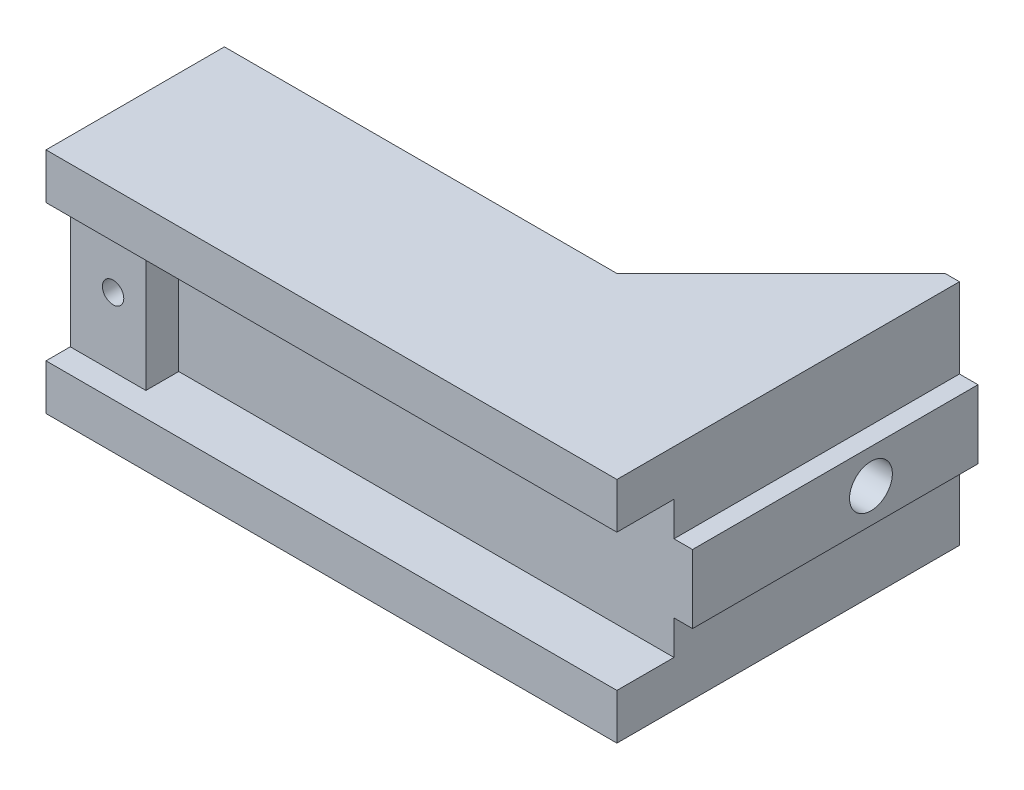
ISO-10303-21;
HEADER;
FILE_DESCRIPTION(('STEP AP214'),'2;1');
FILE_NAME('part.step','',(''),(''),'','','');
FILE_SCHEMA(('AUTOMOTIVE_DESIGN { 1 0 10303 214 1 1 1 1 }'));
ENDSEC;
DATA;
#1=APPLICATION_CONTEXT('core data for automotive mechanical design processes');
#2=APPLICATION_PROTOCOL_DEFINITION('international standard','automotive_design',2000,#1);
#3=PRODUCT_CONTEXT('',#1,'mechanical');
#4=PRODUCT('Part','Part','',(#3));
#5=PRODUCT_RELATED_PRODUCT_CATEGORY('part','',(#4));
#6=PRODUCT_DEFINITION_FORMATION('','',#4);
#7=PRODUCT_DEFINITION_CONTEXT('part definition',#1,'design');
#8=PRODUCT_DEFINITION('design','',#6,#7);
#9=PRODUCT_DEFINITION_SHAPE('','',#8);
#10=(LENGTH_UNIT() NAMED_UNIT(*) SI_UNIT(.MILLI.,.METRE.));
#11=(NAMED_UNIT(*) PLANE_ANGLE_UNIT() SI_UNIT($,.RADIAN.));
#12=(NAMED_UNIT(*) SI_UNIT($,.STERADIAN.) SOLID_ANGLE_UNIT());
#13=UNCERTAINTY_MEASURE_WITH_UNIT(LENGTH_MEASURE(1.E-05),#10,'distance_accuracy_value','');
#14=(GEOMETRIC_REPRESENTATION_CONTEXT(3) GLOBAL_UNCERTAINTY_ASSIGNED_CONTEXT((#13)) GLOBAL_UNIT_ASSIGNED_CONTEXT((#10,
#11,#12)) REPRESENTATION_CONTEXT('',''));
#15=CARTESIAN_POINT('',(0.,0.,0.));
#16=DIRECTION('',(0.,0.,1.));
#17=DIRECTION('',(1.,0.,0.));
#18=AXIS2_PLACEMENT_3D('',#15,#16,#17);
#19=CARTESIAN_POINT('',(25.,47.446165846632,8.5));
#20=DIRECTION('',(1.,0.,0.));
#21=DIRECTION('',(0.,0.,-1.));
#22=AXIS2_PLACEMENT_3D('',#19,#20,#21);
#23=PLANE('',#22);
#24=DIRECTION('',(0.,-1.,0.));
#25=VECTOR('',#24,1.);
#26=CARTESIAN_POINT('',(25.,47.446165846632,-11.5));
#27=LINE('',#26,#25);
#28=CARTESIAN_POINT('',(25.,-2.4,-11.5));
#29=VERTEX_POINT('',#28);
#30=CARTESIAN_POINT('',(25.,-8.,-11.5));
#31=VERTEX_POINT('',#30);
#32=EDGE_CURVE('E263',#29,#31,#27,.T.);
#33=ORIENTED_EDGE('',*,*,#32,.F.);
#34=DIRECTION('',(0.,0.,1.));
#35=VECTOR('',#34,1.);
#36=CARTESIAN_POINT('',(25.,-2.4,-16.4729267036625));
#37=LINE('',#36,#35);
#38=CARTESIAN_POINT('',(25.,-2.4,8.5));
#39=VERTEX_POINT('',#38);
#40=EDGE_CURVE('E205',#29,#39,#37,.T.);
#41=ORIENTED_EDGE('',*,*,#40,.T.);
#42=DIRECTION('',(0.,-1.,0.));
#43=VECTOR('',#42,1.);
#44=CARTESIAN_POINT('',(25.,47.446165846632,8.5));
#45=LINE('',#44,#43);
#46=CARTESIAN_POINT('',(25.,-4.8,8.5));
#47=VERTEX_POINT('',#46);
#48=EDGE_CURVE('E256',#39,#47,#45,.T.);
#49=ORIENTED_EDGE('',*,*,#48,.T.);
#50=DIRECTION('',(0.,0.,1.));
#51=VECTOR('',#50,1.);
#52=CARTESIAN_POINT('',(25.,-4.8,8.5));
#53=LINE('',#52,#51);
#54=CARTESIAN_POINT('',(25.,-4.8,12.5));
#55=VERTEX_POINT('',#54);
#56=EDGE_CURVE('E233',#47,#55,#53,.T.);
#57=ORIENTED_EDGE('',*,*,#56,.T.);
#58=DIRECTION('',(0.,-1.,0.));
#59=VECTOR('',#58,1.);
#60=CARTESIAN_POINT('',(25.,-4.8,12.5));
#61=LINE('',#60,#59);
#62=CARTESIAN_POINT('',(25.,-8.,12.5));
#63=VERTEX_POINT('',#62);
#64=EDGE_CURVE('E229',#55,#63,#61,.T.);
#65=ORIENTED_EDGE('',*,*,#64,.T.);
#66=DIRECTION('',(0.,0.,1.));
#67=VECTOR('',#66,1.);
#68=CARTESIAN_POINT('',(25.,-8.,8.5));
#69=LINE('',#68,#67);
#70=EDGE_CURVE('E236',#31,#63,#69,.T.);
#71=ORIENTED_EDGE('',*,*,#70,.F.);
#72=EDGE_LOOP('',(#33,#41,#49,#57,#65,#71));
#73=FACE_BOUND('',#72,.T.);
#74=ADVANCED_FACE('F34',(#73),#23,.T.);
#75=CARTESIAN_POINT('',(15.,4.8,8.5));
#76=DIRECTION('',(0.,0.,-1.));
#77=DIRECTION('',(-1.,0.,0.));
#78=AXIS2_PLACEMENT_3D('',#75,#76,#77);
#79=PLANE('',#78);
#80=CARTESIAN_POINT('',(25.,4.8,8.5));
#81=VERTEX_POINT('',#80);
#82=CARTESIAN_POINT('',(25.,2.4,8.5));
#83=VERTEX_POINT('',#82);
#84=EDGE_CURVE('E269',#81,#83,#45,.T.);
#85=ORIENTED_EDGE('',*,*,#84,.F.);
#86=DIRECTION('',(-1.,0.,0.));
#87=VECTOR('',#86,1.);
#88=CARTESIAN_POINT('',(15.,4.8,8.5));
#89=LINE('',#88,#87);
#90=CARTESIAN_POINT('',(-9.7,4.8,8.5));
#91=VERTEX_POINT('',#90);
#92=EDGE_CURVE('E43',#81,#91,#89,.T.);
#93=ORIENTED_EDGE('',*,*,#92,.T.);
#94=DIRECTION('',(0.,1.,0.));
#95=VECTOR('',#94,1.);
#96=CARTESIAN_POINT('',(-9.7,-4.8,8.5));
#97=LINE('',#96,#95);
#98=CARTESIAN_POINT('',(-9.7,-4.8,8.5));
#99=VERTEX_POINT('',#98);
#100=EDGE_CURVE('E330',#99,#91,#97,.T.);
#101=ORIENTED_EDGE('',*,*,#100,.F.);
#102=DIRECTION('',(-1.,0.,0.));
#103=VECTOR('',#102,1.);
#104=CARTESIAN_POINT('',(15.,-4.8,8.5));
#105=LINE('',#104,#103);
#106=EDGE_CURVE('E387',#47,#99,#105,.T.);
#107=ORIENTED_EDGE('',*,*,#106,.F.);
#108=ORIENTED_EDGE('',*,*,#48,.F.);
#109=DIRECTION('',(1.,0.,0.));
#110=VECTOR('',#109,1.);
#111=CARTESIAN_POINT('',(25.,-2.4,8.5));
#112=LINE('',#111,#110);
#113=CARTESIAN_POINT('',(26.3,-2.4,8.5));
#114=VERTEX_POINT('',#113);
#115=EDGE_CURVE('E55',#39,#114,#112,.T.);
#116=ORIENTED_EDGE('',*,*,#115,.T.);
#117=DIRECTION('',(0.,1.,0.));
#118=VECTOR('',#117,1.);
#119=CARTESIAN_POINT('',(26.3,-2.4,8.5));
#120=LINE('',#119,#118);
#121=CARTESIAN_POINT('',(26.3,2.4,8.5));
#122=VERTEX_POINT('',#121);
#123=EDGE_CURVE('E202',#114,#122,#120,.T.);
#124=ORIENTED_EDGE('',*,*,#123,.T.);
#125=DIRECTION('',(-1.,0.,0.));
#126=VECTOR('',#125,1.);
#127=CARTESIAN_POINT('',(25.,2.4,8.5));
#128=LINE('',#127,#126);
#129=EDGE_CURVE('E207',#122,#83,#128,.T.);
#130=ORIENTED_EDGE('',*,*,#129,.T.);
#131=EDGE_LOOP('',(#85,#93,#101,#107,#108,#116,#124,#130));
#132=FACE_BOUND('',#131,.T.);
#133=ADVANCED_FACE('F414',(#132),#79,.F.);
#134=CARTESIAN_POINT('',(-12.,0.,0.));
#135=DIRECTION('',(0.,0.,1.));
#136=DIRECTION('',(1.,0.,0.));
#137=AXIS2_PLACEMENT_3D('',#134,#135,#136);
#138=CYLINDRICAL_SURFACE('',#137,0.75);
#139=CARTESIAN_POINT('',(-12.,0.,10.8));
#140=DIRECTION('',(0.,0.,1.));
#141=DIRECTION('',(1.,0.,0.));
#142=AXIS2_PLACEMENT_3D('',#139,#140,#141);
#143=CIRCLE('',#142,0.75);
#144=CARTESIAN_POINT('',(-11.25,0.,10.8));
#145=VERTEX_POINT('',#144);
#146=EDGE_CURVE('E327',#145,#145,#143,.T.);
#147=ORIENTED_EDGE('',*,*,#146,.T.);
#148=EDGE_LOOP('',(#147));
#149=FACE_BOUND('',#148,.T.);
#150=CARTESIAN_POINT('',(-12.,0.,2.3));
#151=DIRECTION('',(0.,0.,-1.));
#152=DIRECTION('',(-1.,0.,0.));
#153=AXIS2_PLACEMENT_3D('',#150,#151,#152);
#154=CIRCLE('',#153,0.75);
#155=CARTESIAN_POINT('',(-12.75,0.,2.3));
#156=VERTEX_POINT('',#155);
#157=EDGE_CURVE('E315',#156,#156,#154,.F.);
#158=ORIENTED_EDGE('',*,*,#157,.F.);
#159=EDGE_LOOP('',(#158));
#160=FACE_BOUND('',#159,.T.);
#161=ADVANCED_FACE('F420',(#149,#160),#138,.F.);
#162=CARTESIAN_POINT('',(15.,4.8,12.5));
#163=DIRECTION('',(0.,1.,0.));
#164=DIRECTION('',(0.,0.,1.));
#165=AXIS2_PLACEMENT_3D('',#162,#163,#164);
#166=PLANE('',#165);
#167=DIRECTION('',(-1.,0.,0.));
#168=VECTOR('',#167,1.);
#169=CARTESIAN_POINT('',(-15.,4.8,10.8));
#170=LINE('',#169,#168);
#171=CARTESIAN_POINT('',(-9.7,4.8,10.8));
#172=VERTEX_POINT('',#171);
#173=CARTESIAN_POINT('',(-15.,4.8,10.8));
#174=VERTEX_POINT('',#173);
#175=EDGE_CURVE('E340',#172,#174,#170,.T.);
#176=ORIENTED_EDGE('',*,*,#175,.F.);
#177=DIRECTION('',(0.,0.,-1.));
#178=VECTOR('',#177,1.);
#179=CARTESIAN_POINT('',(-9.7,4.8,10.8));
#180=LINE('',#179,#178);
#181=EDGE_CURVE('E343',#172,#91,#180,.T.);
#182=ORIENTED_EDGE('',*,*,#181,.T.);
#183=ORIENTED_EDGE('',*,*,#92,.F.);
#184=DIRECTION('',(0.,0.,-1.));
#185=VECTOR('',#184,1.);
#186=CARTESIAN_POINT('',(25.,4.8,12.5));
#187=LINE('',#186,#185);
#188=CARTESIAN_POINT('',(25.,4.8,12.5));
#189=VERTEX_POINT('',#188);
#190=EDGE_CURVE('E226',#189,#81,#187,.T.);
#191=ORIENTED_EDGE('',*,*,#190,.F.);
#192=DIRECTION('',(-1.,0.,0.));
#193=VECTOR('',#192,1.);
#194=CARTESIAN_POINT('',(15.,4.8,12.5));
#195=LINE('',#194,#193);
#196=CARTESIAN_POINT('',(-15.,4.8,12.5));
#197=VERTEX_POINT('',#196);
#198=EDGE_CURVE('E11',#189,#197,#195,.T.);
#199=ORIENTED_EDGE('',*,*,#198,.T.);
#200=DIRECTION('',(0.,0.,-1.));
#201=VECTOR('',#200,1.);
#202=CARTESIAN_POINT('',(-15.,4.8,12.5));
#203=LINE('',#202,#201);
#204=EDGE_CURVE('E360',#197,#174,#203,.T.);
#205=ORIENTED_EDGE('',*,*,#204,.T.);
#206=EDGE_LOOP('',(#176,#182,#183,#191,#199,#205));
#207=FACE_BOUND('',#206,.T.);
#208=ADVANCED_FACE('F469',(#207),#166,.F.);
#209=CARTESIAN_POINT('',(15.,-4.8,12.5));
#210=DIRECTION('',(0.,-1.,0.));
#211=DIRECTION('',(0.,0.,-1.));
#212=AXIS2_PLACEMENT_3D('',#209,#210,#211);
#213=PLANE('',#212);
#214=DIRECTION('',(1.,0.,0.));
#215=VECTOR('',#214,1.);
#216=CARTESIAN_POINT('',(-15.,-4.8,10.8));
#217=LINE('',#216,#215);
#218=CARTESIAN_POINT('',(-15.,-4.8,10.8));
#219=VERTEX_POINT('',#218);
#220=CARTESIAN_POINT('',(-9.7,-4.8,10.8));
#221=VERTEX_POINT('',#220);
#222=EDGE_CURVE('E334',#219,#221,#217,.T.);
#223=ORIENTED_EDGE('',*,*,#222,.F.);
#224=DIRECTION('',(0.,0.,1.));
#225=VECTOR('',#224,1.);
#226=CARTESIAN_POINT('',(-15.,-4.8,12.5));
#227=LINE('',#226,#225);
#228=CARTESIAN_POINT('',(-15.,-4.8,12.5));
#229=VERTEX_POINT('',#228);
#230=EDGE_CURVE('E362',#219,#229,#227,.T.);
#231=ORIENTED_EDGE('',*,*,#230,.T.);
#232=DIRECTION('',(-1.,0.,0.));
#233=VECTOR('',#232,1.);
#234=CARTESIAN_POINT('',(15.,-4.8,12.5));
#235=LINE('',#234,#233);
#236=EDGE_CURVE('E384',#55,#229,#235,.T.);
#237=ORIENTED_EDGE('',*,*,#236,.F.);
#238=ORIENTED_EDGE('',*,*,#56,.F.);
#239=ORIENTED_EDGE('',*,*,#106,.T.);
#240=DIRECTION('',(0.,0.,-1.));
#241=VECTOR('',#240,1.);
#242=CARTESIAN_POINT('',(-9.7,-4.8,10.8));
#243=LINE('',#242,#241);
#244=EDGE_CURVE('E348',#221,#99,#243,.T.);
#245=ORIENTED_EDGE('',*,*,#244,.F.);
#246=EDGE_LOOP('',(#223,#231,#237,#238,#239,#245));
#247=FACE_BOUND('',#246,.T.);
#248=ADVANCED_FACE('F623',(#247),#213,.F.);
#249=CARTESIAN_POINT('',(15.,8.,12.5));
#250=DIRECTION('',(0.,0.,-1.));
#251=DIRECTION('',(0.,1.,0.));
#252=AXIS2_PLACEMENT_3D('',#249,#250,#251);
#253=PLANE('',#252);
#254=DIRECTION('',(0.,-1.,0.));
#255=VECTOR('',#254,1.);
#256=CARTESIAN_POINT('',(-15.,8.,12.5));
#257=LINE('',#256,#255);
#258=CARTESIAN_POINT('',(-15.,8.,12.5));
#259=VERTEX_POINT('',#258);
#260=EDGE_CURVE('E357',#259,#197,#257,.T.);
#261=ORIENTED_EDGE('',*,*,#260,.T.);
#262=ORIENTED_EDGE('',*,*,#198,.F.);
#263=DIRECTION('',(0.,-1.,0.));
#264=VECTOR('',#263,1.);
#265=CARTESIAN_POINT('',(25.,8.,12.5));
#266=LINE('',#265,#264);
#267=CARTESIAN_POINT('',(25.,8.,12.5));
#268=VERTEX_POINT('',#267);
#269=EDGE_CURVE('E230',#268,#189,#266,.T.);
#270=ORIENTED_EDGE('',*,*,#269,.F.);
#271=DIRECTION('',(-1.,0.,0.));
#272=VECTOR('',#271,1.);
#273=CARTESIAN_POINT('',(15.,8.,12.5));
#274=LINE('',#273,#272);
#275=EDGE_CURVE('E373',#268,#259,#274,.T.);
#276=ORIENTED_EDGE('',*,*,#275,.T.);
#277=EDGE_LOOP('',(#261,#262,#270,#276));
#278=FACE_BOUND('',#277,.T.);
#279=ADVANCED_FACE('F36',(#278),#253,.F.);
#280=CARTESIAN_POINT('',(15.,-4.8,12.5));
#281=DIRECTION('',(0.,0.,-1.));
#282=DIRECTION('',(0.,1.,0.));
#283=AXIS2_PLACEMENT_3D('',#280,#281,#282);
#284=PLANE('',#283);
#285=DIRECTION('',(0.,-1.,0.));
#286=VECTOR('',#285,1.);
#287=CARTESIAN_POINT('',(-15.,-4.8,12.5));
#288=LINE('',#287,#286);
#289=CARTESIAN_POINT('',(-15.,-8.,12.5));
#290=VERTEX_POINT('',#289);
#291=EDGE_CURVE('E364',#229,#290,#288,.T.);
#292=ORIENTED_EDGE('',*,*,#291,.T.);
#293=DIRECTION('',(-1.,0.,0.));
#294=VECTOR('',#293,1.);
#295=CARTESIAN_POINT('',(15.,-8.,12.5));
#296=LINE('',#295,#294);
#297=EDGE_CURVE('E381',#63,#290,#296,.T.);
#298=ORIENTED_EDGE('',*,*,#297,.F.);
#299=ORIENTED_EDGE('',*,*,#64,.F.);
#300=ORIENTED_EDGE('',*,*,#236,.T.);
#301=EDGE_LOOP('',(#292,#298,#299,#300));
#302=FACE_BOUND('',#301,.T.);
#303=ADVANCED_FACE('F642',(#302),#284,.F.);
#304=CARTESIAN_POINT('',(15.,-8.,12.5));
#305=DIRECTION('',(0.,1.,0.));
#306=DIRECTION('',(0.,0.,1.));
#307=AXIS2_PLACEMENT_3D('',#304,#305,#306);
#308=PLANE('',#307);
#309=DIRECTION('',(0.,0.,-1.));
#310=VECTOR('',#309,1.);
#311=CARTESIAN_POINT('',(-15.,-8.,12.5));
#312=LINE('',#311,#310);
#313=CARTESIAN_POINT('',(-15.,-8.,0.));
#314=VERTEX_POINT('',#313);
#315=EDGE_CURVE('E366',#290,#314,#312,.T.);
#316=ORIENTED_EDGE('',*,*,#315,.T.);
#317=DIRECTION('',(-1.,0.,0.));
#318=VECTOR('',#317,1.);
#319=CARTESIAN_POINT('',(15.,-8.,0.));
#320=LINE('',#319,#318);
#321=CARTESIAN_POINT('',(12.5,-8.,0.));
#322=VERTEX_POINT('',#321);
#323=EDGE_CURVE('E379',#322,#314,#320,.T.);
#324=ORIENTED_EDGE('',*,*,#323,.F.);
#325=DIRECTION('',(0.707106781186548,0.,-0.707106781186547));
#326=VECTOR('',#325,1.);
#327=CARTESIAN_POINT('',(12.5,-8.,0.));
#328=LINE('',#327,#326);
#329=CARTESIAN_POINT('',(24.,-8.,-11.5));
#330=VERTEX_POINT('',#329);
#331=EDGE_CURVE('E250',#322,#330,#328,.T.);
#332=ORIENTED_EDGE('',*,*,#331,.T.);
#333=DIRECTION('',(1.,0.,0.));
#334=VECTOR('',#333,1.);
#335=CARTESIAN_POINT('',(24.,-8.,-11.5));
#336=LINE('',#335,#334);
#337=EDGE_CURVE('E253',#330,#31,#336,.T.);
#338=ORIENTED_EDGE('',*,*,#337,.T.);
#339=ORIENTED_EDGE('',*,*,#70,.T.);
#340=ORIENTED_EDGE('',*,*,#297,.T.);
#341=EDGE_LOOP('',(#316,#324,#332,#338,#339,#340));
#342=FACE_BOUND('',#341,.T.);
#343=ADVANCED_FACE('F454',(#342),#308,.F.);
#344=CARTESIAN_POINT('',(15.,8.,0.));
#345=DIRECTION('',(0.,0.,1.));
#346=DIRECTION('',(1.,0.,0.));
#347=AXIS2_PLACEMENT_3D('',#344,#345,#346);
#348=PLANE('',#347);
#349=DIRECTION('',(0.866025403784439,0.5,0.));
#350=VECTOR('',#349,1.);
#351=CARTESIAN_POINT('',(-14.8,1.61658075373095,0.));
#352=LINE('',#351,#350);
#353=CARTESIAN_POINT('',(-14.8,1.61658075373095,0.));
#354=VERTEX_POINT('',#353);
#355=CARTESIAN_POINT('',(-12.,3.2331615074619,0.));
#356=VERTEX_POINT('',#355);
#357=EDGE_CURVE('E300',#354,#356,#352,.T.);
#358=ORIENTED_EDGE('',*,*,#357,.F.);
#359=DIRECTION('',(0.,1.,0.));
#360=VECTOR('',#359,1.);
#361=CARTESIAN_POINT('',(-14.8,-1.61658075373095,0.));
#362=LINE('',#361,#360);
#363=CARTESIAN_POINT('',(-14.8,-1.61658075373095,0.));
#364=VERTEX_POINT('',#363);
#365=EDGE_CURVE('E278',#364,#354,#362,.T.);
#366=ORIENTED_EDGE('',*,*,#365,.F.);
#367=DIRECTION('',(-0.866025403784439,0.5,0.));
#368=VECTOR('',#367,1.);
#369=CARTESIAN_POINT('',(-12.,-3.23316150746191,0.));
#370=LINE('',#369,#368);
#371=CARTESIAN_POINT('',(-12.,-3.23316150746191,0.));
#372=VERTEX_POINT('',#371);
#373=EDGE_CURVE('E283',#372,#364,#370,.T.);
#374=ORIENTED_EDGE('',*,*,#373,.F.);
#375=DIRECTION('',(-0.866025403784439,-0.5,0.));
#376=VECTOR('',#375,1.);
#377=CARTESIAN_POINT('',(-9.2,-1.61658075373095,0.));
#378=LINE('',#377,#376);
#379=CARTESIAN_POINT('',(-9.2,-1.61658075373095,0.));
#380=VERTEX_POINT('',#379);
#381=EDGE_CURVE('E308',#380,#372,#378,.T.);
#382=ORIENTED_EDGE('',*,*,#381,.F.);
#383=DIRECTION('',(0.,-1.,0.));
#384=VECTOR('',#383,1.);
#385=CARTESIAN_POINT('',(-9.2,1.61658075373095,0.));
#386=LINE('',#385,#384);
#387=CARTESIAN_POINT('',(-9.2,1.61658075373095,0.));
#388=VERTEX_POINT('',#387);
#389=EDGE_CURVE('E306',#388,#380,#386,.T.);
#390=ORIENTED_EDGE('',*,*,#389,.F.);
#391=DIRECTION('',(0.866025403784439,-0.5,0.));
#392=VECTOR('',#391,1.);
#393=CARTESIAN_POINT('',(-12.,3.2331615074619,0.));
#394=LINE('',#393,#392);
#395=EDGE_CURVE('E303',#356,#388,#394,.T.);
#396=ORIENTED_EDGE('',*,*,#395,.F.);
#397=EDGE_LOOP('',(#358,#366,#374,#382,#390,#396));
#398=FACE_BOUND('',#397,.T.);
#399=DIRECTION('',(0.,1.,0.));
#400=VECTOR('',#399,1.);
#401=CARTESIAN_POINT('',(-15.,8.,0.));
#402=LINE('',#401,#400);
#403=CARTESIAN_POINT('',(-15.,8.,0.));
#404=VERTEX_POINT('',#403);
#405=EDGE_CURVE('E369',#314,#404,#402,.T.);
#406=ORIENTED_EDGE('',*,*,#405,.T.);
#407=DIRECTION('',(-1.,0.,0.));
#408=VECTOR('',#407,1.);
#409=CARTESIAN_POINT('',(15.,8.,0.));
#410=LINE('',#409,#408);
#411=CARTESIAN_POINT('',(12.5,8.,0.));
#412=VERTEX_POINT('',#411);
#413=EDGE_CURVE('E376',#412,#404,#410,.T.);
#414=ORIENTED_EDGE('',*,*,#413,.F.);
#415=DIRECTION('',(0.,-1.,0.));
#416=VECTOR('',#415,1.);
#417=CARTESIAN_POINT('',(12.5,47.446165846632,0.));
#418=LINE('',#417,#416);
#419=CARTESIAN_POINT('',(12.5,0.,0.));
#420=VERTEX_POINT('',#419);
#421=EDGE_CURVE('E273',#412,#420,#418,.T.);
#422=ORIENTED_EDGE('',*,*,#421,.T.);
#423=EDGE_CURVE('E450',#420,#322,#418,.T.);
#424=ORIENTED_EDGE('',*,*,#423,.T.);
#425=ORIENTED_EDGE('',*,*,#323,.T.);
#426=EDGE_LOOP('',(#406,#414,#422,#424,#425));
#427=FACE_BOUND('',#426,.T.);
#428=ADVANCED_FACE('F452',(#398,#427),#348,.F.);
#429=CARTESIAN_POINT('',(15.,8.,12.5));
#430=DIRECTION('',(0.,-1.,0.));
#431=DIRECTION('',(0.,0.,-1.));
#432=AXIS2_PLACEMENT_3D('',#429,#430,#431);
#433=PLANE('',#432);
#434=ORIENTED_EDGE('',*,*,#275,.F.);
#435=DIRECTION('',(0.,0.,-1.));
#436=VECTOR('',#435,1.);
#437=CARTESIAN_POINT('',(25.,8.,8.5));
#438=LINE('',#437,#436);
#439=CARTESIAN_POINT('',(25.,8.,-11.5));
#440=VERTEX_POINT('',#439);
#441=EDGE_CURVE('E245',#268,#440,#438,.T.);
#442=ORIENTED_EDGE('',*,*,#441,.T.);
#443=DIRECTION('',(-1.,0.,0.));
#444=VECTOR('',#443,1.);
#445=CARTESIAN_POINT('',(24.,8.,-11.5));
#446=LINE('',#445,#444);
#447=CARTESIAN_POINT('',(24.,8.,-11.5));
#448=VERTEX_POINT('',#447);
#449=EDGE_CURVE('E242',#440,#448,#446,.T.);
#450=ORIENTED_EDGE('',*,*,#449,.T.);
#451=DIRECTION('',(-0.707106781186548,0.,0.707106781186547));
#452=VECTOR('',#451,1.);
#453=CARTESIAN_POINT('',(12.5,8.,0.));
#454=LINE('',#453,#452);
#455=EDGE_CURVE('E239',#448,#412,#454,.T.);
#456=ORIENTED_EDGE('',*,*,#455,.T.);
#457=ORIENTED_EDGE('',*,*,#413,.T.);
#458=DIRECTION('',(0.,0.,1.));
#459=VECTOR('',#458,1.);
#460=CARTESIAN_POINT('',(-15.,8.,12.5));
#461=LINE('',#460,#459);
#462=EDGE_CURVE('E371',#404,#259,#461,.T.);
#463=ORIENTED_EDGE('',*,*,#462,.T.);
#464=EDGE_LOOP('',(#434,#442,#450,#456,#457,#463));
#465=FACE_BOUND('',#464,.T.);
#466=ADVANCED_FACE('F443',(#465),#433,.F.);
#467=CARTESIAN_POINT('',(-15.,0.,0.));
#468=DIRECTION('',(1.,0.,0.));
#469=DIRECTION('',(0.,0.,-1.));
#470=AXIS2_PLACEMENT_3D('',#467,#468,#469);
#471=PLANE('',#470);
#472=ORIENTED_EDGE('',*,*,#230,.F.);
#473=DIRECTION('',(0.,-1.,0.));
#474=VECTOR('',#473,1.);
#475=CARTESIAN_POINT('',(-15.,-4.8,10.8));
#476=LINE('',#475,#474);
#477=EDGE_CURVE('E331',#174,#219,#476,.T.);
#478=ORIENTED_EDGE('',*,*,#477,.F.);
#479=ORIENTED_EDGE('',*,*,#204,.F.);
#480=ORIENTED_EDGE('',*,*,#260,.F.);
#481=ORIENTED_EDGE('',*,*,#462,.F.);
#482=ORIENTED_EDGE('',*,*,#405,.F.);
#483=ORIENTED_EDGE('',*,*,#315,.F.);
#484=ORIENTED_EDGE('',*,*,#291,.F.);
#485=EDGE_LOOP('',(#472,#478,#479,#480,#481,#482,#483,#484));
#486=FACE_BOUND('',#485,.T.);
#487=CARTESIAN_POINT('',(-15.,4.5,4.));
#488=DIRECTION('',(1.,0.,0.));
#489=DIRECTION('',(0.,0.,1.));
#490=AXIS2_PLACEMENT_3D('',#487,#488,#489);
#491=CIRCLE('',#490,1.2);
#492=CARTESIAN_POINT('',(-15.,4.5,5.2));
#493=VERTEX_POINT('',#492);
#494=EDGE_CURVE('E351',#493,#493,#491,.T.);
#495=ORIENTED_EDGE('',*,*,#494,.T.);
#496=EDGE_LOOP('',(#495));
#497=FACE_BOUND('',#496,.T.);
#498=CARTESIAN_POINT('',(-15.,-4.5,4.));
#499=DIRECTION('',(1.,0.,0.));
#500=DIRECTION('',(0.,0.,-1.));
#501=AXIS2_PLACEMENT_3D('',#498,#499,#500);
#502=CIRCLE('',#501,1.2);
#503=CARTESIAN_POINT('',(-15.,-4.5,2.8));
#504=VERTEX_POINT('',#503);
#505=EDGE_CURVE('E354',#504,#504,#502,.T.);
#506=ORIENTED_EDGE('',*,*,#505,.T.);
#507=EDGE_LOOP('',(#506));
#508=FACE_BOUND('',#507,.T.);
#509=ADVANCED_FACE('F461',(#486,#497,#508),#471,.F.);
#510=CARTESIAN_POINT('',(-15.,-4.5,4.));
#511=DIRECTION('',(1.,0.,0.));
#512=DIRECTION('',(0.,0.,-1.));
#513=AXIS2_PLACEMENT_3D('',#510,#511,#512);
#514=CYLINDRICAL_SURFACE('',#513,1.2);
#515=CARTESIAN_POINT('',(-9.,-4.5,4.));
#516=DIRECTION('',(-1.,0.,0.));
#517=DIRECTION('',(0.,0.,1.));
#518=AXIS2_PLACEMENT_3D('',#515,#516,#517);
#519=CIRCLE('',#518,1.2);
#520=CARTESIAN_POINT('',(-9.,-4.5,5.2));
#521=VERTEX_POINT('',#520);
#522=EDGE_CURVE('E274',#521,#521,#519,.F.);
#523=ORIENTED_EDGE('',*,*,#522,.T.);
#524=EDGE_LOOP('',(#523));
#525=FACE_BOUND('',#524,.T.);
#526=ORIENTED_EDGE('',*,*,#505,.F.);
#527=EDGE_LOOP('',(#526));
#528=FACE_BOUND('',#527,.T.);
#529=ADVANCED_FACE('F540',(#525,#528),#514,.F.);
#530=CARTESIAN_POINT('',(-15.,4.5,4.));
#531=DIRECTION('',(1.,0.,0.));
#532=DIRECTION('',(0.,0.,-1.));
#533=AXIS2_PLACEMENT_3D('',#530,#531,#532);
#534=CYLINDRICAL_SURFACE('',#533,1.2);
#535=CARTESIAN_POINT('',(-9.,4.5,4.));
#536=DIRECTION('',(-1.,0.,0.));
#537=DIRECTION('',(0.,0.,1.));
#538=AXIS2_PLACEMENT_3D('',#535,#536,#537);
#539=CIRCLE('',#538,1.2);
#540=CARTESIAN_POINT('',(-9.,4.5,5.2));
#541=VERTEX_POINT('',#540);
#542=EDGE_CURVE('E247',#541,#541,#539,.F.);
#543=ORIENTED_EDGE('',*,*,#542,.T.);
#544=EDGE_LOOP('',(#543));
#545=FACE_BOUND('',#544,.T.);
#546=ORIENTED_EDGE('',*,*,#494,.F.);
#547=EDGE_LOOP('',(#546));
#548=FACE_BOUND('',#547,.T.);
#549=ADVANCED_FACE('F394',(#545,#548),#534,.F.);
#550=CARTESIAN_POINT('',(0.,0.,10.8));
#551=DIRECTION('',(0.,0.,-1.));
#552=DIRECTION('',(-1.,0.,0.));
#553=AXIS2_PLACEMENT_3D('',#550,#551,#552);
#554=PLANE('',#553);
#555=ORIENTED_EDGE('',*,*,#477,.T.);
#556=ORIENTED_EDGE('',*,*,#222,.T.);
#557=DIRECTION('',(0.,1.,0.));
#558=VECTOR('',#557,1.);
#559=CARTESIAN_POINT('',(-9.7,-4.8,10.8));
#560=LINE('',#559,#558);
#561=EDGE_CURVE('E337',#221,#172,#560,.T.);
#562=ORIENTED_EDGE('',*,*,#561,.T.);
#563=ORIENTED_EDGE('',*,*,#175,.T.);
#564=EDGE_LOOP('',(#555,#556,#562,#563));
#565=FACE_BOUND('',#564,.T.);
#566=ORIENTED_EDGE('',*,*,#146,.F.);
#567=EDGE_LOOP('',(#566));
#568=FACE_BOUND('',#567,.T.);
#569=ADVANCED_FACE('F603',(#565,#568),#554,.F.);
#570=CARTESIAN_POINT('',(-9.7,-4.8,10.8));
#571=DIRECTION('',(-1.,0.,0.));
#572=DIRECTION('',(0.,0.,1.));
#573=AXIS2_PLACEMENT_3D('',#570,#571,#572);
#574=PLANE('',#573);
#575=ORIENTED_EDGE('',*,*,#100,.T.);
#576=ORIENTED_EDGE('',*,*,#181,.F.);
#577=ORIENTED_EDGE('',*,*,#561,.F.);
#578=ORIENTED_EDGE('',*,*,#244,.T.);
#579=EDGE_LOOP('',(#575,#576,#577,#578));
#580=FACE_BOUND('',#579,.T.);
#581=ADVANCED_FACE('F716',(#580),#574,.F.);
#582=CARTESIAN_POINT('',(0.,0.,2.3));
#583=DIRECTION('',(0.,0.,-1.));
#584=DIRECTION('',(-1.,0.,0.));
#585=AXIS2_PLACEMENT_3D('',#582,#583,#584);
#586=PLANE('',#585);
#587=DIRECTION('',(0.,1.,0.));
#588=VECTOR('',#587,1.);
#589=CARTESIAN_POINT('',(-14.8,-1.61658075373095,2.3));
#590=LINE('',#589,#588);
#591=CARTESIAN_POINT('',(-14.8,-1.61658075373095,2.3));
#592=VERTEX_POINT('',#591);
#593=CARTESIAN_POINT('',(-14.8,1.61658075373095,2.3));
#594=VERTEX_POINT('',#593);
#595=EDGE_CURVE('E279',#592,#594,#590,.T.);
#596=ORIENTED_EDGE('',*,*,#595,.T.);
#597=DIRECTION('',(0.866025403784439,0.5,0.));
#598=VECTOR('',#597,1.);
#599=CARTESIAN_POINT('',(-14.8,1.61658075373095,2.3));
#600=LINE('',#599,#598);
#601=CARTESIAN_POINT('',(-12.,3.2331615074619,2.3));
#602=VERTEX_POINT('',#601);
#603=EDGE_CURVE('E282',#594,#602,#600,.T.);
#604=ORIENTED_EDGE('',*,*,#603,.T.);
#605=DIRECTION('',(0.866025403784439,-0.5,0.));
#606=VECTOR('',#605,1.);
#607=CARTESIAN_POINT('',(-12.,3.2331615074619,2.3));
#608=LINE('',#607,#606);
#609=CARTESIAN_POINT('',(-9.2,1.61658075373095,2.3));
#610=VERTEX_POINT('',#609);
#611=EDGE_CURVE('E286',#602,#610,#608,.T.);
#612=ORIENTED_EDGE('',*,*,#611,.T.);
#613=DIRECTION('',(0.,-1.,0.));
#614=VECTOR('',#613,1.);
#615=CARTESIAN_POINT('',(-9.2,1.61658075373095,2.3));
#616=LINE('',#615,#614);
#617=CARTESIAN_POINT('',(-9.2,-1.61658075373095,2.3));
#618=VERTEX_POINT('',#617);
#619=EDGE_CURVE('E289',#610,#618,#616,.T.);
#620=ORIENTED_EDGE('',*,*,#619,.T.);
#621=DIRECTION('',(-0.866025403784439,-0.5,0.));
#622=VECTOR('',#621,1.);
#623=CARTESIAN_POINT('',(-9.2,-1.61658075373095,2.3));
#624=LINE('',#623,#622);
#625=CARTESIAN_POINT('',(-12.,-3.23316150746191,2.3));
#626=VERTEX_POINT('',#625);
#627=EDGE_CURVE('E292',#618,#626,#624,.T.);
#628=ORIENTED_EDGE('',*,*,#627,.T.);
#629=DIRECTION('',(-0.866025403784439,0.5,0.));
#630=VECTOR('',#629,1.);
#631=CARTESIAN_POINT('',(-12.,-3.23316150746191,2.3));
#632=LINE('',#631,#630);
#633=EDGE_CURVE('E295',#626,#592,#632,.T.);
#634=ORIENTED_EDGE('',*,*,#633,.T.);
#635=EDGE_LOOP('',(#596,#604,#612,#620,#628,#634));
#636=FACE_BOUND('',#635,.T.);
#637=ORIENTED_EDGE('',*,*,#157,.T.);
#638=EDGE_LOOP('',(#637));
#639=FACE_BOUND('',#638,.T.);
#640=ADVANCED_FACE('F554',(#636,#639),#586,.T.);
#641=CARTESIAN_POINT('',(-14.8,-1.61658075373095,2.3));
#642=DIRECTION('',(-1.,0.,0.));
#643=DIRECTION('',(0.,0.,1.));
#644=AXIS2_PLACEMENT_3D('',#641,#642,#643);
#645=PLANE('',#644);
#646=ORIENTED_EDGE('',*,*,#365,.T.);
#647=DIRECTION('',(0.,0.,-1.));
#648=VECTOR('',#647,1.);
#649=CARTESIAN_POINT('',(-14.8,1.61658075373095,2.3));
#650=LINE('',#649,#648);
#651=EDGE_CURVE('E298',#594,#354,#650,.T.);
#652=ORIENTED_EDGE('',*,*,#651,.F.);
#653=ORIENTED_EDGE('',*,*,#595,.F.);
#654=DIRECTION('',(0.,0.,-1.));
#655=VECTOR('',#654,1.);
#656=CARTESIAN_POINT('',(-14.8,-1.61658075373095,2.3));
#657=LINE('',#656,#655);
#658=EDGE_CURVE('E313',#592,#364,#657,.T.);
#659=ORIENTED_EDGE('',*,*,#658,.T.);
#660=EDGE_LOOP('',(#646,#652,#653,#659));
#661=FACE_BOUND('',#660,.T.);
#662=ADVANCED_FACE('F549',(#661),#645,.F.);
#663=CARTESIAN_POINT('',(-12.,-3.23316150746191,2.3));
#664=DIRECTION('',(-0.5,-0.866025403784439,0.));
#665=DIRECTION('',(0.866025403784439,-0.5,0.));
#666=AXIS2_PLACEMENT_3D('',#663,#664,#665);
#667=PLANE('',#666);
#668=ORIENTED_EDGE('',*,*,#373,.T.);
#669=ORIENTED_EDGE('',*,*,#658,.F.);
#670=ORIENTED_EDGE('',*,*,#633,.F.);
#671=DIRECTION('',(0.,0.,-1.));
#672=VECTOR('',#671,1.);
#673=CARTESIAN_POINT('',(-12.,-3.23316150746191,2.3));
#674=LINE('',#673,#672);
#675=EDGE_CURVE('E316',#626,#372,#674,.T.);
#676=ORIENTED_EDGE('',*,*,#675,.T.);
#677=EDGE_LOOP('',(#668,#669,#670,#676));
#678=FACE_BOUND('',#677,.T.);
#679=ADVANCED_FACE('F553',(#678),#667,.F.);
#680=CARTESIAN_POINT('',(-9.2,-1.61658075373095,2.3));
#681=DIRECTION('',(0.5,-0.866025403784439,0.));
#682=DIRECTION('',(0.866025403784439,0.5,0.));
#683=AXIS2_PLACEMENT_3D('',#680,#681,#682);
#684=PLANE('',#683);
#685=ORIENTED_EDGE('',*,*,#381,.T.);
#686=ORIENTED_EDGE('',*,*,#675,.F.);
#687=ORIENTED_EDGE('',*,*,#627,.F.);
#688=DIRECTION('',(0.,0.,-1.));
#689=VECTOR('',#688,1.);
#690=CARTESIAN_POINT('',(-9.2,-1.61658075373095,2.3));
#691=LINE('',#690,#689);
#692=EDGE_CURVE('E318',#618,#380,#691,.T.);
#693=ORIENTED_EDGE('',*,*,#692,.T.);
#694=EDGE_LOOP('',(#685,#686,#687,#693));
#695=FACE_BOUND('',#694,.T.);
#696=ADVANCED_FACE('F568',(#695),#684,.F.);
#697=CARTESIAN_POINT('',(-9.2,1.61658075373095,2.3));
#698=DIRECTION('',(1.,0.,0.));
#699=DIRECTION('',(0.,0.,-1.));
#700=AXIS2_PLACEMENT_3D('',#697,#698,#699);
#701=PLANE('',#700);
#702=ORIENTED_EDGE('',*,*,#389,.T.);
#703=ORIENTED_EDGE('',*,*,#692,.F.);
#704=ORIENTED_EDGE('',*,*,#619,.F.);
#705=DIRECTION('',(0.,0.,-1.));
#706=VECTOR('',#705,1.);
#707=CARTESIAN_POINT('',(-9.2,1.61658075373095,2.3));
#708=LINE('',#707,#706);
#709=EDGE_CURVE('E321',#610,#388,#708,.T.);
#710=ORIENTED_EDGE('',*,*,#709,.T.);
#711=EDGE_LOOP('',(#702,#703,#704,#710));
#712=FACE_BOUND('',#711,.T.);
#713=ADVANCED_FACE('F564',(#712),#701,.F.);
#714=CARTESIAN_POINT('',(-12.,3.2331615074619,2.3));
#715=DIRECTION('',(0.5,0.866025403784439,0.));
#716=DIRECTION('',(-0.866025403784439,0.5,0.));
#717=AXIS2_PLACEMENT_3D('',#714,#715,#716);
#718=PLANE('',#717);
#719=ORIENTED_EDGE('',*,*,#395,.T.);
#720=ORIENTED_EDGE('',*,*,#709,.F.);
#721=ORIENTED_EDGE('',*,*,#611,.F.);
#722=DIRECTION('',(0.,0.,-1.));
#723=VECTOR('',#722,1.);
#724=CARTESIAN_POINT('',(-12.,3.2331615074619,2.3));
#725=LINE('',#724,#723);
#726=EDGE_CURVE('E323',#602,#356,#725,.T.);
#727=ORIENTED_EDGE('',*,*,#726,.T.);
#728=EDGE_LOOP('',(#719,#720,#721,#727));
#729=FACE_BOUND('',#728,.T.);
#730=ADVANCED_FACE('F408',(#729),#718,.F.);
#731=CARTESIAN_POINT('',(-14.8,1.61658075373095,2.3));
#732=DIRECTION('',(-0.5,0.866025403784439,0.));
#733=DIRECTION('',(-0.866025403784439,-0.5,0.));
#734=AXIS2_PLACEMENT_3D('',#731,#732,#733);
#735=PLANE('',#734);
#736=ORIENTED_EDGE('',*,*,#357,.T.);
#737=ORIENTED_EDGE('',*,*,#726,.F.);
#738=ORIENTED_EDGE('',*,*,#603,.F.);
#739=ORIENTED_EDGE('',*,*,#651,.T.);
#740=EDGE_LOOP('',(#736,#737,#738,#739));
#741=FACE_BOUND('',#740,.T.);
#742=ADVANCED_FACE('F400',(#741),#735,.F.);
#743=CARTESIAN_POINT('',(-9.,47.446165846632,8.49999999999999));
#744=DIRECTION('',(-1.,0.,0.));
#745=DIRECTION('',(0.,0.,1.));
#746=AXIS2_PLACEMENT_3D('',#743,#744,#745);
#747=PLANE('',#746);
#748=ORIENTED_EDGE('',*,*,#542,.F.);
#749=EDGE_LOOP('',(#748));
#750=FACE_BOUND('',#749,.T.);
#751=ADVANCED_FACE('F397',(#750),#747,.T.);
#752=ORIENTED_EDGE('',*,*,#522,.F.);
#753=EDGE_LOOP('',(#752));
#754=FACE_BOUND('',#753,.T.);
#755=ADVANCED_FACE('F399',(#754),#747,.T.);
#756=CARTESIAN_POINT('',(12.5,47.446165846632,0.));
#757=DIRECTION('',(-0.707106781186547,0.,-0.707106781186548));
#758=DIRECTION('',(-0.707106781186548,0.,0.707106781186547));
#759=AXIS2_PLACEMENT_3D('',#756,#757,#758);
#760=PLANE('',#759);
#761=ORIENTED_EDGE('',*,*,#423,.F.);
#762=CARTESIAN_POINT('',(16.5,0.,-4.));
#763=DIRECTION('',(-0.707106781186547,0.,-0.707106781186548));
#764=DIRECTION('',(0.707106781186548,0.,-0.707106781186547));
#765=AXIS2_PLACEMENT_3D('',#762,#763,#764);
#766=ELLIPSE('',#765,5.65685424949238,4.);
#767=EDGE_CURVE('E38',#420,#420,#766,.T.);
#768=ORIENTED_EDGE('',*,*,#767,.F.);
#769=ORIENTED_EDGE('',*,*,#421,.F.);
#770=ORIENTED_EDGE('',*,*,#455,.F.);
#771=DIRECTION('',(0.,-1.,0.));
#772=VECTOR('',#771,1.);
#773=CARTESIAN_POINT('',(24.,47.446165846632,-11.5));
#774=LINE('',#773,#772);
#775=EDGE_CURVE('E259',#448,#330,#774,.T.);
#776=ORIENTED_EDGE('',*,*,#775,.T.);
#777=ORIENTED_EDGE('',*,*,#331,.F.);
#778=EDGE_LOOP('',(#761,#768,#769,#770,#776,#777));
#779=FACE_BOUND('',#778,.T.);
#780=ADVANCED_FACE('F406',(#779),#760,.T.);
#781=CARTESIAN_POINT('',(24.,47.446165846632,-11.5));
#782=DIRECTION('',(0.,0.,-1.));
#783=DIRECTION('',(-1.,0.,0.));
#784=AXIS2_PLACEMENT_3D('',#781,#782,#783);
#785=PLANE('',#784);
#786=ORIENTED_EDGE('',*,*,#449,.F.);
#787=CARTESIAN_POINT('',(25.,2.4,-11.5));
#788=VERTEX_POINT('',#787);
#789=EDGE_CURVE('E243',#440,#788,#27,.T.);
#790=ORIENTED_EDGE('',*,*,#789,.T.);
#791=DIRECTION('',(-1.,0.,0.));
#792=VECTOR('',#791,1.);
#793=CARTESIAN_POINT('',(25.,2.4,-11.5));
#794=LINE('',#793,#792);
#795=CARTESIAN_POINT('',(26.3,2.4,-11.5));
#796=VERTEX_POINT('',#795);
#797=EDGE_CURVE('E193',#796,#788,#794,.T.);
#798=ORIENTED_EDGE('',*,*,#797,.F.);
#799=DIRECTION('',(0.,1.,0.));
#800=VECTOR('',#799,1.);
#801=CARTESIAN_POINT('',(26.3,-2.4,-11.5));
#802=LINE('',#801,#800);
#803=CARTESIAN_POINT('',(26.3,-2.4,-11.5));
#804=VERTEX_POINT('',#803);
#805=EDGE_CURVE('E186',#804,#796,#802,.T.);
#806=ORIENTED_EDGE('',*,*,#805,.F.);
#807=DIRECTION('',(1.,0.,0.));
#808=VECTOR('',#807,1.);
#809=CARTESIAN_POINT('',(25.,-2.4,-11.5));
#810=LINE('',#809,#808);
#811=EDGE_CURVE('E191',#29,#804,#810,.T.);
#812=ORIENTED_EDGE('',*,*,#811,.F.);
#813=ORIENTED_EDGE('',*,*,#32,.T.);
#814=ORIENTED_EDGE('',*,*,#337,.F.);
#815=ORIENTED_EDGE('',*,*,#775,.F.);
#816=EDGE_LOOP('',(#786,#790,#798,#806,#812,#813,#814,#815));
#817=FACE_BOUND('',#816,.T.);
#818=ADVANCED_FACE('F189',(#817),#785,.T.);
#819=DIRECTION('',(0.,0.,1.));
#820=VECTOR('',#819,1.);
#821=CARTESIAN_POINT('',(25.,2.4,-16.4729267036625));
#822=LINE('',#821,#820);
#823=EDGE_CURVE('E217',#788,#83,#822,.T.);
#824=ORIENTED_EDGE('',*,*,#823,.F.);
#825=ORIENTED_EDGE('',*,*,#789,.F.);
#826=ORIENTED_EDGE('',*,*,#441,.F.);
#827=ORIENTED_EDGE('',*,*,#269,.T.);
#828=ORIENTED_EDGE('',*,*,#190,.T.);
#829=ORIENTED_EDGE('',*,*,#84,.T.);
#830=EDGE_LOOP('',(#824,#825,#826,#827,#828,#829));
#831=FACE_BOUND('',#830,.T.);
#832=ADVANCED_FACE('F416',(#831),#23,.T.);
#833=CARTESIAN_POINT('',(25.,-2.4,-16.4729267036625));
#834=DIRECTION('',(0.,-1.,0.));
#835=DIRECTION('',(0.,0.,-1.));
#836=AXIS2_PLACEMENT_3D('',#833,#834,#835);
#837=PLANE('',#836);
#838=ORIENTED_EDGE('',*,*,#40,.F.);
#839=ORIENTED_EDGE('',*,*,#811,.T.);
#840=DIRECTION('',(0.,0.,1.));
#841=VECTOR('',#840,1.);
#842=CARTESIAN_POINT('',(26.3,-2.4,-16.4729267036625));
#843=LINE('',#842,#841);
#844=EDGE_CURVE('E197',#804,#114,#843,.T.);
#845=ORIENTED_EDGE('',*,*,#844,.T.);
#846=ORIENTED_EDGE('',*,*,#115,.F.);
#847=EDGE_LOOP('',(#838,#839,#845,#846));
#848=FACE_BOUND('',#847,.T.);
#849=ADVANCED_FACE('F204',(#848),#837,.T.);
#850=CARTESIAN_POINT('',(26.3,-2.4,-16.4729267036625));
#851=DIRECTION('',(1.,0.,0.));
#852=DIRECTION('',(0.,0.,-1.));
#853=AXIS2_PLACEMENT_3D('',#850,#851,#852);
#854=PLANE('',#853);
#855=CARTESIAN_POINT('',(26.3,0.,-4.));
#856=DIRECTION('',(1.,0.,0.));
#857=DIRECTION('',(0.,0.,-1.));
#858=AXIS2_PLACEMENT_3D('',#855,#856,#857);
#859=CIRCLE('',#858,1.5);
#860=CARTESIAN_POINT('',(26.3,0.,-5.5));
#861=VERTEX_POINT('',#860);
#862=EDGE_CURVE('E787',#861,#861,#859,.T.);
#863=ORIENTED_EDGE('',*,*,#862,.F.);
#864=EDGE_LOOP('',(#863));
#865=FACE_BOUND('',#864,.T.);
#866=ORIENTED_EDGE('',*,*,#844,.F.);
#867=ORIENTED_EDGE('',*,*,#805,.T.);
#868=DIRECTION('',(0.,0.,1.));
#869=VECTOR('',#868,1.);
#870=CARTESIAN_POINT('',(26.3,2.4,-16.4729267036625));
#871=LINE('',#870,#869);
#872=EDGE_CURVE('E196',#796,#122,#871,.T.);
#873=ORIENTED_EDGE('',*,*,#872,.T.);
#874=ORIENTED_EDGE('',*,*,#123,.F.);
#875=EDGE_LOOP('',(#866,#867,#873,#874));
#876=FACE_BOUND('',#875,.T.);
#877=ADVANCED_FACE('F200',(#865,#876),#854,.T.);
#878=CARTESIAN_POINT('',(25.,2.4,-16.4729267036625));
#879=DIRECTION('',(0.,1.,0.));
#880=DIRECTION('',(-1.,0.,0.));
#881=AXIS2_PLACEMENT_3D('',#878,#879,#880);
#882=PLANE('',#881);
#883=ORIENTED_EDGE('',*,*,#872,.F.);
#884=ORIENTED_EDGE('',*,*,#797,.T.);
#885=ORIENTED_EDGE('',*,*,#823,.T.);
#886=ORIENTED_EDGE('',*,*,#129,.F.);
#887=EDGE_LOOP('',(#883,#884,#885,#886));
#888=FACE_BOUND('',#887,.T.);
#889=ADVANCED_FACE('F471',(#888),#882,.T.);
#890=CARTESIAN_POINT('',(-15.,0.,-4.00000000000001));
#891=DIRECTION('',(1.,0.,0.));
#892=DIRECTION('',(0.,0.,-1.));
#893=AXIS2_PLACEMENT_3D('',#890,#891,#892);
#894=CYLINDRICAL_SURFACE('',#893,4.);
#895=ORIENTED_EDGE('',*,*,#767,.T.);
#896=EDGE_LOOP('',(#895));
#897=FACE_BOUND('',#896,.T.);
#898=CARTESIAN_POINT('',(22.,0.,-4.));
#899=DIRECTION('',(1.,0.,0.));
#900=DIRECTION('',(0.,0.,-1.));
#901=AXIS2_PLACEMENT_3D('',#898,#899,#900);
#902=CIRCLE('',#901,4.);
#903=CARTESIAN_POINT('',(22.,0.,-8.));
#904=VERTEX_POINT('',#903);
#905=EDGE_CURVE('E784',#904,#904,#902,.T.);
#906=ORIENTED_EDGE('',*,*,#905,.T.);
#907=EDGE_LOOP('',(#906));
#908=FACE_BOUND('',#907,.T.);
#909=ADVANCED_FACE('F473',(#897,#908),#894,.F.);
#910=CARTESIAN_POINT('',(22.,0.,-4.));
#911=DIRECTION('',(1.,0.,0.));
#912=DIRECTION('',(0.,0.,-1.));
#913=AXIS2_PLACEMENT_3D('',#910,#911,#912);
#914=PLANE('',#913);
#915=CARTESIAN_POINT('',(22.,0.,-4.));
#916=DIRECTION('',(-1.,0.,0.));
#917=DIRECTION('',(0.,0.,1.));
#918=AXIS2_PLACEMENT_3D('',#915,#916,#917);
#919=CIRCLE('',#918,1.5);
#920=CARTESIAN_POINT('',(22.,0.,-2.5));
#921=VERTEX_POINT('',#920);
#922=EDGE_CURVE('E792',#921,#921,#919,.T.);
#923=ORIENTED_EDGE('',*,*,#922,.F.);
#924=EDGE_LOOP('',(#923));
#925=FACE_BOUND('',#924,.T.);
#926=ORIENTED_EDGE('',*,*,#905,.F.);
#927=EDGE_LOOP('',(#926));
#928=FACE_BOUND('',#927,.T.);
#929=ADVANCED_FACE('F479',(#925,#928),#914,.F.);
#930=CARTESIAN_POINT('',(26.300025,0.,-4.));
#931=DIRECTION('',(-1.,0.,0.));
#932=DIRECTION('',(0.,0.,1.));
#933=AXIS2_PLACEMENT_3D('',#930,#931,#932);
#934=CYLINDRICAL_SURFACE('',#933,1.5);
#935=ORIENTED_EDGE('',*,*,#862,.T.);
#936=EDGE_LOOP('',(#935));
#937=FACE_BOUND('',#936,.T.);
#938=ORIENTED_EDGE('',*,*,#922,.T.);
#939=EDGE_LOOP('',(#938));
#940=FACE_BOUND('',#939,.T.);
#941=ADVANCED_FACE('F798',(#937,#940),#934,.F.);
#942=CLOSED_SHELL('',(#74,#133,#161,#208,#248,#279,#303,#343,#428,#466,#509,#529,#549,#569,#581,
#640,#662,#679,#696,#713,#730,#742,#751,#755,#780,#818,#832,#849,#877,#889,#909,#929,#941));
#943=MANIFOLD_SOLID_BREP('B2',#942);
#944=ADVANCED_BREP_SHAPE_REPRESENTATION('',(#18,#943),#14);
#945=SHAPE_DEFINITION_REPRESENTATION(#9,#944);
ENDSEC;
END-ISO-10303-21;
